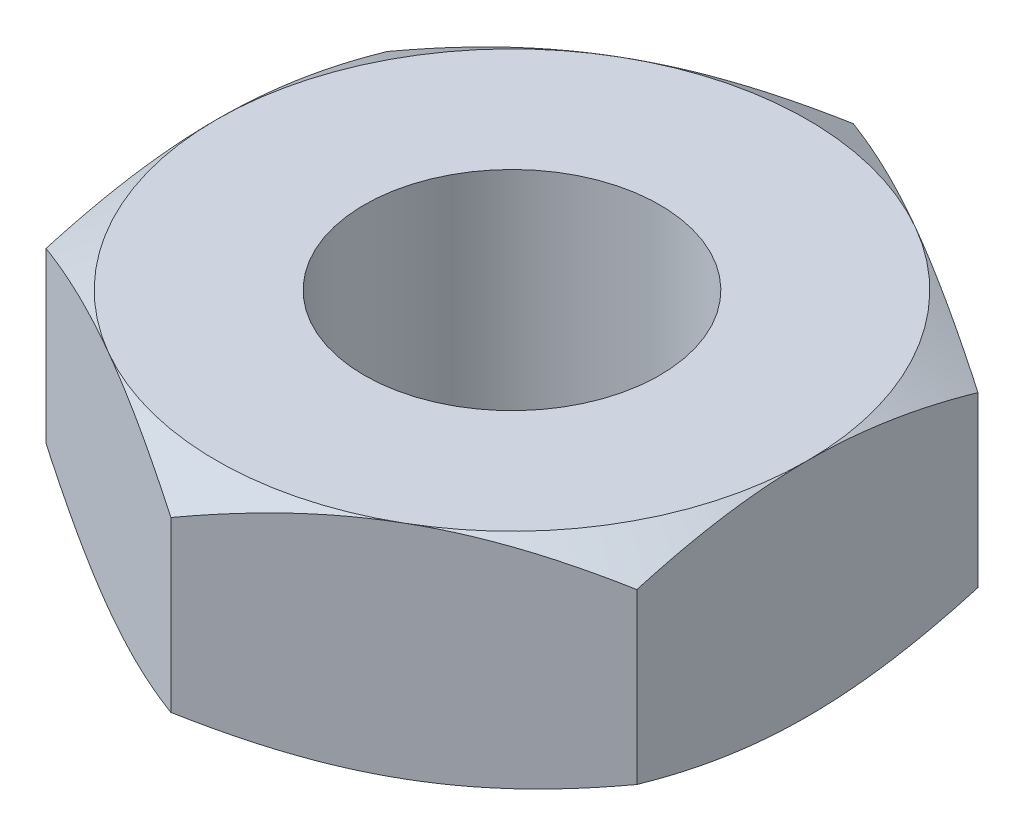
ISO-10303-21;
HEADER;
FILE_DESCRIPTION(('STEP AP214'),'2;1');
FILE_NAME('part.step','',(''),(''),'','','');
FILE_SCHEMA(('AUTOMOTIVE_DESIGN { 1 0 10303 214 1 1 1 1 }'));
ENDSEC;
DATA;
#1=APPLICATION_CONTEXT('core data for automotive mechanical design processes');
#2=APPLICATION_PROTOCOL_DEFINITION('international standard','automotive_design',2000,#1);
#3=PRODUCT_CONTEXT('',#1,'mechanical');
#4=PRODUCT('Part','Part','',(#3));
#5=PRODUCT_RELATED_PRODUCT_CATEGORY('part','',(#4));
#6=PRODUCT_DEFINITION_FORMATION('','',#4);
#7=PRODUCT_DEFINITION_CONTEXT('part definition',#1,'design');
#8=PRODUCT_DEFINITION('design','',#6,#7);
#9=PRODUCT_DEFINITION_SHAPE('','',#8);
#10=(LENGTH_UNIT() NAMED_UNIT(*) SI_UNIT(.MILLI.,.METRE.));
#11=(NAMED_UNIT(*) PLANE_ANGLE_UNIT() SI_UNIT($,.RADIAN.));
#12=(NAMED_UNIT(*) SI_UNIT($,.STERADIAN.) SOLID_ANGLE_UNIT());
#13=UNCERTAINTY_MEASURE_WITH_UNIT(LENGTH_MEASURE(1.E-05),#10,'distance_accuracy_value','');
#14=(GEOMETRIC_REPRESENTATION_CONTEXT(3) GLOBAL_UNCERTAINTY_ASSIGNED_CONTEXT((#13)) GLOBAL_UNIT_ASSIGNED_CONTEXT((#10,
#11,#12)) REPRESENTATION_CONTEXT('',''));
#15=CARTESIAN_POINT('',(0.,0.,0.));
#16=DIRECTION('',(0.,0.,1.));
#17=DIRECTION('',(1.,0.,0.));
#18=AXIS2_PLACEMENT_3D('',#15,#16,#17);
#19=CARTESIAN_POINT('',(0.,0.,0.));
#20=DIRECTION('',(0.,1.,0.));
#21=DIRECTION('',(0.,0.,1.));
#22=AXIS2_PLACEMENT_3D('',#19,#20,#21);
#23=PLANE('',#22);
#24=CARTESIAN_POINT('',(0.,0.,0.));
#25=DIRECTION('',(0.,1.,0.));
#26=DIRECTION('',(0.,0.,1.));
#27=AXIS2_PLACEMENT_3D('',#24,#25,#26);
#28=CIRCLE('',#27,1.);
#29=CARTESIAN_POINT('',(0.,0.,1.));
#30=VERTEX_POINT('',#29);
#31=EDGE_CURVE('E277',#30,#30,#28,.T.);
#32=ORIENTED_EDGE('',*,*,#31,.T.);
#33=EDGE_LOOP('',(#32));
#34=FACE_BOUND('',#33,.T.);
#35=CARTESIAN_POINT('',(0.,0.,0.));
#36=DIRECTION('',(0.,1.,0.));
#37=DIRECTION('',(0.,0.,1.));
#38=AXIS2_PLACEMENT_3D('',#35,#36,#37);
#39=CIRCLE('',#38,2.);
#40=CARTESIAN_POINT('',(1.,0.,1.73205080756888));
#41=VERTEX_POINT('',#40);
#42=CARTESIAN_POINT('',(-1.,0.,1.73205080756888));
#43=VERTEX_POINT('',#42);
#44=EDGE_CURVE('E52',#41,#43,#39,.F.);
#45=ORIENTED_EDGE('',*,*,#44,.T.);
#46=CARTESIAN_POINT('',(-2.,0.,0.));
#47=VERTEX_POINT('',#46);
#48=EDGE_CURVE('E12',#43,#47,#39,.F.);
#49=ORIENTED_EDGE('',*,*,#48,.T.);
#50=CARTESIAN_POINT('',(-1.,0.,-1.73205080756888));
#51=VERTEX_POINT('',#50);
#52=EDGE_CURVE('E58',#47,#51,#39,.F.);
#53=ORIENTED_EDGE('',*,*,#52,.T.);
#54=CARTESIAN_POINT('',(1.,0.,-1.73205080756888));
#55=VERTEX_POINT('',#54);
#56=EDGE_CURVE('E398',#51,#55,#39,.F.);
#57=ORIENTED_EDGE('',*,*,#56,.T.);
#58=CARTESIAN_POINT('',(2.,0.,0.));
#59=VERTEX_POINT('',#58);
#60=EDGE_CURVE('E161',#55,#59,#39,.F.);
#61=ORIENTED_EDGE('',*,*,#60,.T.);
#62=CARTESIAN_POINT('',(0.,0.,0.));
#63=DIRECTION('',(0.,1.,0.));
#64=DIRECTION('',(0.,0.,1.));
#65=AXIS2_PLACEMENT_3D('',#62,#63,#64);
#66=CIRCLE('',#65,2.);
#67=EDGE_CURVE('E142',#41,#59,#66,.T.);
#68=ORIENTED_EDGE('',*,*,#67,.F.);
#69=EDGE_LOOP('',(#45,#49,#53,#57,#61,#68));
#70=FACE_BOUND('',#69,.T.);
#71=ADVANCED_FACE('F47',(#34,#70),#23,.F.);
#72=CARTESIAN_POINT('',(0.,1.5,0.));
#73=DIRECTION('',(0.,1.,0.));
#74=DIRECTION('',(0.,0.,1.));
#75=AXIS2_PLACEMENT_3D('',#72,#73,#74);
#76=PLANE('',#75);
#77=CARTESIAN_POINT('',(0.,1.5,0.));
#78=DIRECTION('',(0.,1.,0.));
#79=DIRECTION('',(0.,0.,1.));
#80=AXIS2_PLACEMENT_3D('',#77,#78,#79);
#81=CIRCLE('',#80,1.);
#82=CARTESIAN_POINT('',(0.,1.5,1.));
#83=VERTEX_POINT('',#82);
#84=EDGE_CURVE('E272',#83,#83,#81,.T.);
#85=ORIENTED_EDGE('',*,*,#84,.F.);
#86=EDGE_LOOP('',(#85));
#87=FACE_BOUND('',#86,.T.);
#88=CARTESIAN_POINT('',(0.,1.5,0.));
#89=DIRECTION('',(0.,1.,0.));
#90=DIRECTION('',(0.,0.,1.));
#91=AXIS2_PLACEMENT_3D('',#88,#89,#90);
#92=CIRCLE('',#91,2.);
#93=CARTESIAN_POINT('',(-1.,1.5,1.73205080756888));
#94=VERTEX_POINT('',#93);
#95=CARTESIAN_POINT('',(1.,1.5,1.73205080756888));
#96=VERTEX_POINT('',#95);
#97=EDGE_CURVE('E334',#94,#96,#92,.T.);
#98=ORIENTED_EDGE('',*,*,#97,.T.);
#99=CARTESIAN_POINT('',(2.,1.5,0.));
#100=VERTEX_POINT('',#99);
#101=EDGE_CURVE('E337',#96,#100,#92,.T.);
#102=ORIENTED_EDGE('',*,*,#101,.T.);
#103=CARTESIAN_POINT('',(1.,1.5,-1.73205080756888));
#104=VERTEX_POINT('',#103);
#105=EDGE_CURVE('E349',#100,#104,#92,.T.);
#106=ORIENTED_EDGE('',*,*,#105,.T.);
#107=CARTESIAN_POINT('',(-1.,1.5,-1.73205080756888));
#108=VERTEX_POINT('',#107);
#109=EDGE_CURVE('E353',#104,#108,#92,.T.);
#110=ORIENTED_EDGE('',*,*,#109,.T.);
#111=CARTESIAN_POINT('',(-2.,1.5,0.));
#112=VERTEX_POINT('',#111);
#113=EDGE_CURVE('E346',#108,#112,#92,.T.);
#114=ORIENTED_EDGE('',*,*,#113,.T.);
#115=EDGE_CURVE('E339',#112,#94,#92,.T.);
#116=ORIENTED_EDGE('',*,*,#115,.T.);
#117=EDGE_LOOP('',(#98,#102,#106,#110,#114,#116));
#118=FACE_BOUND('',#117,.T.);
#119=ADVANCED_FACE('F315',(#87,#118),#76,.T.);
#120=CARTESIAN_POINT('',(2.,1.5,-1.15470053837925));
#121=DIRECTION('',(-0.5,0.,0.866025403784439));
#122=DIRECTION('',(0.866025403784439,0.,0.5));
#123=AXIS2_PLACEMENT_3D('',#120,#121,#122);
#124=PLANE('',#123);
#125=DIRECTION('',(0.,-1.,0.));
#126=VECTOR('',#125,1.);
#127=CARTESIAN_POINT('',(2.,1.5,-1.15470053837925));
#128=LINE('',#127,#126);
#129=CARTESIAN_POINT('',(2.,1.32136720504593,-1.15470053837926));
#130=VERTEX_POINT('',#129);
#131=CARTESIAN_POINT('',(2.,0.17863279495408,-1.15470053837925));
#132=VERTEX_POINT('',#131);
#133=EDGE_CURVE('E276',#130,#132,#128,.T.);
#134=ORIENTED_EDGE('',*,*,#133,.T.);
#135=CARTESIAN_POINT('',(2.0002,0.178699466620497,-1.15458506832542));
#136=CARTESIAN_POINT('',(1.91230873709994,0.149389536100678,-1.20532911262018));
#137=CARTESIAN_POINT('',(1.82365880552641,0.122732851980467,-1.2565111744778));
#138=CARTESIAN_POINT('',(1.6448237530022,0.0762024910207211,-1.3597616401932));
#139=CARTESIAN_POINT('',(1.55463545349496,0.0563452763827793,-1.41183187919145));
#140=CARTESIAN_POINT('',(1.37537661423669,0.0254334640232528,-1.51532701829183));
#141=CARTESIAN_POINT('',(1.28633366177369,0.0141731515985314,-1.56673599086578));
#142=CARTESIAN_POINT('',(1.10782860221496,0.000728662594642262,-1.66979593505373));
#143=CARTESIAN_POINT('',(1.01836714429604,-0.00146664504653133,-1.72144653186531));
#144=CARTESIAN_POINT('',(0.851191646451201,0.00309098933064936,-1.81796535054794));
#145=CARTESIAN_POINT('',(0.773452629734215,0.00872487468701514,-1.86284799277603));
#146=CARTESIAN_POINT('',(0.618481085463866,0.0265838952608289,-1.95232085557725));
#147=CARTESIAN_POINT('',(0.541249094258801,0.0388151360234399,-1.99691076648954));
#148=CARTESIAN_POINT('',(0.385957813517799,0.0693934368676102,-2.08656822922816));
#149=CARTESIAN_POINT('',(0.30791818689262,0.0878701670657161,-2.13162442866767));
#150=CARTESIAN_POINT('',(0.153003134307865,0.129805518212856,-2.221064675979));
#151=CARTESIAN_POINT('',(0.07612572237688,0.153254280492313,-2.26544987045196));
#152=CARTESIAN_POINT('',(-0.000199999999999827,0.178699466620498,-2.30951654681234));
#153=B_SPLINE_CURVE_WITH_KNOTS('',3,(#135,#136,#137,#138,#139,#140,#141,#142,#143,#144,#145,
#146,#147,#148,#149,#150,#151,#152),.UNSPECIFIED.,.F.,.F.,(4,2,2,2,2,2,2,2,4),(0.,
0.31703182469561,0.634825876346563,0.944753967652635,1.25430138000371,1.52387047293094,
1.79368946861028,2.06949491027634,2.34475850821472),.UNSPECIFIED.);
#154=EDGE_CURVE('E71',#132,#55,#153,.T.);
#155=ORIENTED_EDGE('',*,*,#154,.T.);
#156=CARTESIAN_POINT('',(0.,0.178632794954081,-2.3094010767585));
#157=VERTEX_POINT('',#156);
#158=EDGE_CURVE('E206',#55,#157,#153,.T.);
#159=ORIENTED_EDGE('',*,*,#158,.T.);
#160=DIRECTION('',(0.,-1.,0.));
#161=VECTOR('',#160,1.);
#162=CARTESIAN_POINT('',(0.,1.5,-2.3094010767585));
#163=LINE('',#162,#161);
#164=CARTESIAN_POINT('',(0.,1.32136720504592,-2.3094010767585));
#165=VERTEX_POINT('',#164);
#166=EDGE_CURVE('E297',#165,#157,#163,.T.);
#167=ORIENTED_EDGE('',*,*,#166,.F.);
#168=CARTESIAN_POINT('',(2.0002,1.3213005333795,-1.15458506832542));
#169=CARTESIAN_POINT('',(1.91230873709994,1.35061046389932,-1.20532911262018));
#170=CARTESIAN_POINT('',(1.82365880552641,1.37726714801953,-1.2565111744778));
#171=CARTESIAN_POINT('',(1.6448237530022,1.42379750897928,-1.3597616401932));
#172=CARTESIAN_POINT('',(1.55463545349496,1.44365472361722,-1.41183187919145));
#173=CARTESIAN_POINT('',(1.37537661423669,1.47456653597675,-1.51532701829183));
#174=CARTESIAN_POINT('',(1.28633366177369,1.48582684840147,-1.56673599086578));
#175=CARTESIAN_POINT('',(1.10782860221496,1.49927133740536,-1.66979593505373));
#176=CARTESIAN_POINT('',(1.01836714429604,1.50146664504653,-1.72144653186531));
#177=CARTESIAN_POINT('',(0.851191646451201,1.49690901066935,-1.81796535054794));
#178=CARTESIAN_POINT('',(0.773452629734215,1.49127512531298,-1.86284799277603));
#179=CARTESIAN_POINT('',(0.618481085463866,1.47341610473917,-1.95232085557725));
#180=CARTESIAN_POINT('',(0.541249094258801,1.46118486397656,-1.99691076648954));
#181=CARTESIAN_POINT('',(0.385957813517799,1.43060656313239,-2.08656822922816));
#182=CARTESIAN_POINT('',(0.30791818689262,1.41212983293428,-2.13162442866767));
#183=CARTESIAN_POINT('',(0.153003134307865,1.37019448178714,-2.221064675979));
#184=CARTESIAN_POINT('',(0.07612572237688,1.34674571950769,-2.26544987045196));
#185=CARTESIAN_POINT('',(-0.000199999999999837,1.3213005333795,-2.30951654681234));
#186=B_SPLINE_CURVE_WITH_KNOTS('',3,(#168,#169,#170,#171,#172,#173,#174,#175,#176,#177,#178,
#179,#180,#181,#182,#183,#184,#185),.UNSPECIFIED.,.F.,.F.,(4,2,2,2,2,2,2,2,4),(0.,
0.31703182469561,0.634825876346563,0.944753967652635,1.25430138000371,1.52387047293094,
1.79368946861028,2.06949491027634,2.34475850821472),.UNSPECIFIED.);
#187=EDGE_CURVE('E264',#104,#165,#186,.T.);
#188=ORIENTED_EDGE('',*,*,#187,.F.);
#189=EDGE_CURVE('E271',#130,#104,#186,.T.);
#190=ORIENTED_EDGE('',*,*,#189,.F.);
#191=EDGE_LOOP('',(#134,#155,#159,#167,#188,#190));
#192=FACE_BOUND('',#191,.T.);
#193=ADVANCED_FACE('F49',(#192),#124,.F.);
#194=CARTESIAN_POINT('',(0.,1.5,-2.3094010767585));
#195=DIRECTION('',(0.5,0.,0.866025403784439));
#196=DIRECTION('',(0.866025403784439,0.,-0.5));
#197=AXIS2_PLACEMENT_3D('',#194,#195,#196);
#198=PLANE('',#197);
#199=ORIENTED_EDGE('',*,*,#166,.T.);
#200=CARTESIAN_POINT('',(0.000200000000000053,0.178699466620498,-2.30951654681234));
#201=CARTESIAN_POINT('',(-0.0876912629000601,0.149389536100679,-2.25877250251758));
#202=CARTESIAN_POINT('',(-0.176341194473591,0.122732851980467,-2.20759044065996));
#203=CARTESIAN_POINT('',(-0.355176246997802,0.0762024910207212,-2.10433997494456));
#204=CARTESIAN_POINT('',(-0.445364546505037,0.0563452763827794,-2.05226973594631));
#205=CARTESIAN_POINT('',(-0.624623385763306,0.025433464023253,-1.94877459684592));
#206=CARTESIAN_POINT('',(-0.713666338226304,0.0141731515985316,-1.89736562427197));
#207=CARTESIAN_POINT('',(-0.892171397785043,0.000728662594642333,-1.79430568008402));
#208=CARTESIAN_POINT('',(-0.981632855703958,-0.00146664504653142,-1.74265508327244));
#209=CARTESIAN_POINT('',(-1.1488083535488,0.00309098933064909,-1.64613626458981));
#210=CARTESIAN_POINT('',(-1.22654737026578,0.00872487468701486,-1.60125362236173));
#211=CARTESIAN_POINT('',(-1.38151891453613,0.0265838952608287,-1.51178075956051));
#212=CARTESIAN_POINT('',(-1.4587509057412,0.0388151360234397,-1.46719084864821));
#213=CARTESIAN_POINT('',(-1.6140421864822,0.0693934368676102,-1.37753338590959));
#214=CARTESIAN_POINT('',(-1.69208181310738,0.0878701670657163,-1.33247718647009));
#215=CARTESIAN_POINT('',(-1.84699686569214,0.129805518212856,-1.24303693915875));
#216=CARTESIAN_POINT('',(-1.92387427762312,0.153254280492314,-1.1986517446858));
#217=CARTESIAN_POINT('',(-2.0002,0.178699466620498,-1.15458506832541));
#218=B_SPLINE_CURVE_WITH_KNOTS('',3,(#200,#201,#202,#203,#204,#205,#206,#207,#208,#209,#210,
#211,#212,#213,#214,#215,#216,#217),.UNSPECIFIED.,.F.,.F.,(4,2,2,2,2,2,2,2,4),(0.,
0.31703182469561,0.634825876346564,0.944753967652636,1.25430138000371,1.52387047293094,
1.79368946861028,2.06949491027634,2.34475850821472),.UNSPECIFIED.);
#219=EDGE_CURVE('E404',#157,#51,#218,.T.);
#220=ORIENTED_EDGE('',*,*,#219,.T.);
#221=CARTESIAN_POINT('',(-2.,0.178632794954081,-1.15470053837925));
#222=VERTEX_POINT('',#221);
#223=EDGE_CURVE('E225',#51,#222,#218,.T.);
#224=ORIENTED_EDGE('',*,*,#223,.T.);
#225=DIRECTION('',(0.,-1.,0.));
#226=VECTOR('',#225,1.);
#227=CARTESIAN_POINT('',(-2.,1.5,-1.15470053837925));
#228=LINE('',#227,#226);
#229=CARTESIAN_POINT('',(-2.,1.32136720504592,-1.15470053837925));
#230=VERTEX_POINT('',#229);
#231=EDGE_CURVE('E293',#230,#222,#228,.T.);
#232=ORIENTED_EDGE('',*,*,#231,.F.);
#233=CARTESIAN_POINT('',(0.000200000000000067,1.3213005333795,-2.30951654681234));
#234=CARTESIAN_POINT('',(-0.0876912629000599,1.35061046389932,-2.25877250251758));
#235=CARTESIAN_POINT('',(-0.176341194473591,1.37726714801953,-2.20759044065996));
#236=CARTESIAN_POINT('',(-0.355176246997802,1.42379750897928,-2.10433997494456));
#237=CARTESIAN_POINT('',(-0.445364546505037,1.44365472361722,-2.05226973594631));
#238=CARTESIAN_POINT('',(-0.624623385763306,1.47456653597675,-1.94877459684592));
#239=CARTESIAN_POINT('',(-0.713666338226304,1.48582684840147,-1.89736562427197));
#240=CARTESIAN_POINT('',(-0.892171397785043,1.49927133740536,-1.79430568008402));
#241=CARTESIAN_POINT('',(-0.981632855703958,1.50146664504653,-1.74265508327244));
#242=CARTESIAN_POINT('',(-1.1488083535488,1.49690901066935,-1.64613626458981));
#243=CARTESIAN_POINT('',(-1.22654737026578,1.49127512531299,-1.60125362236173));
#244=CARTESIAN_POINT('',(-1.38151891453613,1.47341610473917,-1.51178075956051));
#245=CARTESIAN_POINT('',(-1.4587509057412,1.46118486397656,-1.46719084864821));
#246=CARTESIAN_POINT('',(-1.6140421864822,1.43060656313239,-1.37753338590959));
#247=CARTESIAN_POINT('',(-1.69208181310738,1.41212983293428,-1.33247718647009));
#248=CARTESIAN_POINT('',(-1.84699686569214,1.37019448178714,-1.24303693915875));
#249=CARTESIAN_POINT('',(-1.92387427762312,1.34674571950769,-1.1986517446858));
#250=CARTESIAN_POINT('',(-2.0002,1.3213005333795,-1.15458506832541));
#251=B_SPLINE_CURVE_WITH_KNOTS('',3,(#233,#234,#235,#236,#237,#238,#239,#240,#241,#242,#243,
#244,#245,#246,#247,#248,#249,#250),.UNSPECIFIED.,.F.,.F.,(4,2,2,2,2,2,2,2,4),(0.,
0.31703182469561,0.634825876346564,0.944753967652636,1.25430138000371,1.52387047293094,
1.79368946861028,2.06949491027634,2.34475850821472),.UNSPECIFIED.);
#252=EDGE_CURVE('E256',#108,#230,#251,.T.);
#253=ORIENTED_EDGE('',*,*,#252,.F.);
#254=EDGE_CURVE('E263',#165,#108,#251,.T.);
#255=ORIENTED_EDGE('',*,*,#254,.F.);
#256=EDGE_LOOP('',(#199,#220,#224,#232,#253,#255));
#257=FACE_BOUND('',#256,.T.);
#258=ADVANCED_FACE('F234',(#257),#198,.F.);
#259=CARTESIAN_POINT('',(-2.,1.5,-1.15470053837925));
#260=DIRECTION('',(1.,0.,0.));
#261=DIRECTION('',(0.,0.,-1.));
#262=AXIS2_PLACEMENT_3D('',#259,#260,#261);
#263=PLANE('',#262);
#264=ORIENTED_EDGE('',*,*,#231,.T.);
#265=CARTESIAN_POINT('',(-2.,1.38024356206322,-3.9086858120223));
#266=CARTESIAN_POINT('',(-2.,1.33338477520942,-3.81751112169324));
#267=CARTESIAN_POINT('',(-2.,1.28679021631781,-3.72620145046507));
#268=CARTESIAN_POINT('',(-2.,1.19424910626193,-3.54325228824929));
#269=CARTESIAN_POINT('',(-2.,1.14830256761152,-3.45161279093522));
#270=CARTESIAN_POINT('',(-2.,1.01146715761723,-3.17581300243889));
#271=CARTESIAN_POINT('',(-2.,0.921737415753044,-2.9910709203634));
#272=CARTESIAN_POINT('',(-2.,0.788409395654004,-2.70743624323685));
#273=CARTESIAN_POINT('',(-2.,0.743100656319978,-2.60934831774003));
#274=CARTESIAN_POINT('',(-2.,0.654163775473777,-2.41241507533712));
#275=CARTESIAN_POINT('',(-2.,0.610535569794257,-2.31356978752232));
#276=CARTESIAN_POINT('',(-2.,0.52546531263082,-2.11501734395706));
#277=CARTESIAN_POINT('',(-2.,0.484021797433511,-2.0153108187193));
#278=CARTESIAN_POINT('',(-2.,0.403937006613858,-1.81474539793162));
#279=CARTESIAN_POINT('',(-2.,0.365296392668009,-1.71388623674348));
#280=CARTESIAN_POINT('',(-2.,0.285617620657406,-1.49400593807688));
#281=CARTESIAN_POINT('',(-2.,0.245241020544741,-1.37474151517002));
#282=CARTESIAN_POINT('',(-2.,0.171425178991217,-1.13410850020832));
#283=CARTESIAN_POINT('',(-2.,0.137982386760639,-1.0127410198025));
#284=CARTESIAN_POINT('',(-2.,0.0810163135177482,-0.770071934944816));
#285=CARTESIAN_POINT('',(-2.,0.05731644498316,-0.648812992268315));
#286=CARTESIAN_POINT('',(-2.,0.0214266196550797,-0.404608758962328));
#287=CARTESIAN_POINT('',(-2.,0.00922997508793498,-0.28166449038841));
#288=CARTESIAN_POINT('',(-2.,-0.00207085477321424,-0.0335419748269807));
#289=CARTESIAN_POINT('',(-2.,-0.00100267071105174,0.0916445286709651));
#290=CARTESIAN_POINT('',(-2.,0.0144840452379088,0.341193409529001));
#291=CARTESIAN_POINT('',(-2.,0.028907354371388,0.465555475947228));
#292=CARTESIAN_POINT('',(-2.,0.0695474304125028,0.714833183390078));
#293=CARTESIAN_POINT('',(-2.,0.0959955839540993,0.839709642184882));
#294=CARTESIAN_POINT('',(-2.,0.157986894429598,1.08715459095749));
#295=CARTESIAN_POINT('',(-2.,0.193532661864587,1.20972240762972));
#296=CARTESIAN_POINT('',(-2.,0.269280519283634,1.44650470413582));
#297=CARTESIAN_POINT('',(-2.,0.309153182000627,1.56082665519536));
#298=CARTESIAN_POINT('',(-2.,0.393292544621002,1.78785420479763));
#299=CARTESIAN_POINT('',(-2.,0.437560254612616,1.90055942493322));
#300=CARTESIAN_POINT('',(-2.,0.529372373860236,2.12474648121528));
#301=CARTESIAN_POINT('',(-2.,0.576919977737399,2.23622699843601));
#302=CARTESIAN_POINT('',(-2.,0.674434984945331,2.45812606854002));
#303=CARTESIAN_POINT('',(-2.,0.724402516378928,2.56854456483182));
#304=CARTESIAN_POINT('',(-2.,0.823331957292793,2.78238975570627));
#305=CARTESIAN_POINT('',(-2.,0.87219431445944,2.88586269009035));
#306=CARTESIAN_POINT('',(-2.,0.971202074310625,3.09219555395058));
#307=CARTESIAN_POINT('',(-2.,1.02134751719606,3.19505546409504));
#308=CARTESIAN_POINT('',(-2.,1.12249261908677,3.39994809054478));
#309=CARTESIAN_POINT('',(-2.,1.1734890679984,3.50198239517474));
#310=CARTESIAN_POINT('',(-2.,1.27629914354311,3.70562803087648));
#311=CARTESIAN_POINT('',(-2.,1.32811270118693,3.80723939675145));
#312=CARTESIAN_POINT('',(-2.,1.38024356206322,3.9086858120223));
#313=B_SPLINE_CURVE_WITH_KNOTS('',3,(#265,#266,#267,#268,#269,#270,#271,#272,#273,#274,#275,
#276,#277,#278,#279,#280,#281,#282,#283,#284,#285,#286,#287,#288,#289,#290,#291,#292,#293,#294,
#295,#296,#297,#298,#299,#300,#301,#302,#303,#304,#305,#306,#307,#308,#309,#310,#311,#312),
.UNSPECIFIED.,.F.,.F.,(4,2,2,2,2,2,2,2,2,2,2,2,2,2,2,2,2,2,2,2,2,2,2,4),(0.,0.307531563856155,
0.615069058317577,1.23115557383005,1.55528461857819,1.8794012749051,2.20329794302309,
2.52727082574405,2.9048604545366,3.28225624019068,3.65247322929853,4.02247484779028,
4.39728941630346,4.77223811112902,5.15472880172826,5.53732936883045,5.90044039858863,
6.26363507408059,6.62718863760779,6.99076146751935,7.33404016464889,7.67732963038956,
8.01953135999517,8.36170435024385),.UNSPECIFIED.);
#314=EDGE_CURVE('E224',#222,#47,#313,.T.);
#315=ORIENTED_EDGE('',*,*,#314,.T.);
#316=CARTESIAN_POINT('',(-2.,0.178632794954081,1.15470053837925));
#317=VERTEX_POINT('',#316);
#318=EDGE_CURVE('E216',#47,#317,#313,.T.);
#319=ORIENTED_EDGE('',*,*,#318,.T.);
#320=DIRECTION('',(0.,-1.,0.));
#321=VECTOR('',#320,1.);
#322=CARTESIAN_POINT('',(-2.,1.5,1.15470053837925));
#323=LINE('',#322,#321);
#324=CARTESIAN_POINT('',(-2.,1.32136720504592,1.15470053837925));
#325=VERTEX_POINT('',#324);
#326=EDGE_CURVE('E289',#325,#317,#323,.T.);
#327=ORIENTED_EDGE('',*,*,#326,.F.);
#328=CARTESIAN_POINT('',(-2.,0.119756437936776,-3.9086858120223));
#329=CARTESIAN_POINT('',(-2.,0.166615224790584,-3.81751112169324));
#330=CARTESIAN_POINT('',(-2.,0.213209783682193,-3.72620145046507));
#331=CARTESIAN_POINT('',(-2.,0.305750893738074,-3.54325228824929));
#332=CARTESIAN_POINT('',(-2.,0.351697432388484,-3.45161279093522));
#333=CARTESIAN_POINT('',(-2.,0.488532842382774,-3.17581300243889));
#334=CARTESIAN_POINT('',(-2.,0.578262584246957,-2.9910709203634));
#335=CARTESIAN_POINT('',(-2.,0.711590604345996,-2.70743624323685));
#336=CARTESIAN_POINT('',(-2.,0.756899343680022,-2.60934831774002));
#337=CARTESIAN_POINT('',(-2.,0.845836224526223,-2.41241507533712));
#338=CARTESIAN_POINT('',(-2.,0.889464430205744,-2.31356978752232));
#339=CARTESIAN_POINT('',(-2.,0.974534687369181,-2.11501734395706));
#340=CARTESIAN_POINT('',(-2.,1.01597820256649,-2.0153108187193));
#341=CARTESIAN_POINT('',(-2.,1.09606299338614,-1.81474539793162));
#342=CARTESIAN_POINT('',(-2.,1.13470360733199,-1.71388623674348));
#343=CARTESIAN_POINT('',(-2.,1.21438237934259,-1.49400593807688));
#344=CARTESIAN_POINT('',(-2.,1.25475897945526,-1.37474151517002));
#345=CARTESIAN_POINT('',(-2.,1.32857482100878,-1.13410850020832));
#346=CARTESIAN_POINT('',(-2.,1.36201761323936,-1.0127410198025));
#347=CARTESIAN_POINT('',(-2.,1.41898368648225,-0.770071934944816));
#348=CARTESIAN_POINT('',(-2.,1.44268355501684,-0.648812992268316));
#349=CARTESIAN_POINT('',(-2.,1.47857338034492,-0.404608758962328));
#350=CARTESIAN_POINT('',(-2.,1.49077002491207,-0.281664490388411));
#351=CARTESIAN_POINT('',(-2.,1.50207085477321,-0.0335419748269812));
#352=CARTESIAN_POINT('',(-2.,1.50100267071105,0.0916445286709645));
#353=CARTESIAN_POINT('',(-2.,1.48551595476209,0.341193409529));
#354=CARTESIAN_POINT('',(-2.,1.47109264562861,0.465555475947226));
#355=CARTESIAN_POINT('',(-2.,1.4304525695875,0.714833183390077));
#356=CARTESIAN_POINT('',(-2.,1.4040044160459,0.83970964218488));
#357=CARTESIAN_POINT('',(-2.,1.3420131055704,1.08715459095749));
#358=CARTESIAN_POINT('',(-2.,1.30646733813541,1.20972240762972));
#359=CARTESIAN_POINT('',(-2.,1.23071948071637,1.44650470413582));
#360=CARTESIAN_POINT('',(-2.,1.19084681799937,1.56082665519536));
#361=CARTESIAN_POINT('',(-2.,1.106707455379,1.78785420479763));
#362=CARTESIAN_POINT('',(-2.,1.06243974538738,1.90055942493322));
#363=CARTESIAN_POINT('',(-2.,0.970627626139764,2.12474648121528));
#364=CARTESIAN_POINT('',(-2.,0.923080022262602,2.23622699843601));
#365=CARTESIAN_POINT('',(-2.,0.82556501505467,2.45812606854002));
#366=CARTESIAN_POINT('',(-2.,0.775597483621073,2.56854456483182));
#367=CARTESIAN_POINT('',(-2.,0.676668042707208,2.78238975570627));
#368=CARTESIAN_POINT('',(-2.,0.627805685540561,2.88586269009034));
#369=CARTESIAN_POINT('',(-2.,0.528797925689376,3.09219555395058));
#370=CARTESIAN_POINT('',(-2.,0.478652482803938,3.19505546409504));
#371=CARTESIAN_POINT('',(-2.,0.377507380913227,3.39994809054478));
#372=CARTESIAN_POINT('',(-2.,0.326510932001601,3.50198239517474));
#373=CARTESIAN_POINT('',(-2.,0.223700856456885,3.70562803087648));
#374=CARTESIAN_POINT('',(-2.,0.17188729881307,3.80723939675145));
#375=CARTESIAN_POINT('',(-2.,0.119756437936776,3.9086858120223));
#376=B_SPLINE_CURVE_WITH_KNOTS('',3,(#328,#329,#330,#331,#332,#333,#334,#335,#336,#337,#338,
#339,#340,#341,#342,#343,#344,#345,#346,#347,#348,#349,#350,#351,#352,#353,#354,#355,#356,#357,
#358,#359,#360,#361,#362,#363,#364,#365,#366,#367,#368,#369,#370,#371,#372,#373,#374,#375),
.UNSPECIFIED.,.F.,.F.,(4,2,2,2,2,2,2,2,2,2,2,2,2,2,2,2,2,2,2,2,2,2,2,4),(0.,0.307531563856155,
0.615069058317578,1.23115557383005,1.55528461857819,1.8794012749051,2.20329794302309,
2.52727082574405,2.9048604545366,3.28225624019068,3.65247322929853,4.02247484779028,
4.39728941630346,4.77223811112902,5.15472880172826,5.53732936883045,5.90044039858863,
6.26363507408059,6.62718863760779,6.99076146751935,7.33404016464889,7.67732963038956,
8.01953135999518,8.36170435024385),.UNSPECIFIED.);
#377=EDGE_CURVE('E240',#112,#325,#376,.T.);
#378=ORIENTED_EDGE('',*,*,#377,.F.);
#379=EDGE_CURVE('E248',#230,#112,#376,.T.);
#380=ORIENTED_EDGE('',*,*,#379,.F.);
#381=EDGE_LOOP('',(#264,#315,#319,#327,#378,#380));
#382=FACE_BOUND('',#381,.T.);
#383=ADVANCED_FACE('F230',(#382),#263,.F.);
#384=CARTESIAN_POINT('',(-2.,1.5,1.15470053837925));
#385=DIRECTION('',(0.5,0.,-0.866025403784439));
#386=DIRECTION('',(-0.866025403784439,0.,-0.5));
#387=AXIS2_PLACEMENT_3D('',#384,#385,#386);
#388=PLANE('',#387);
#389=ORIENTED_EDGE('',*,*,#326,.T.);
#390=CARTESIAN_POINT('',(-2.0002,0.178699466620497,1.15458506832541));
#391=CARTESIAN_POINT('',(-1.91230873709994,0.149389536100679,1.20532911262018));
#392=CARTESIAN_POINT('',(-1.82365880552641,0.122732851980467,1.2565111744778));
#393=CARTESIAN_POINT('',(-1.6448237530022,0.076202491020721,1.35976164019319));
#394=CARTESIAN_POINT('',(-1.55463545349496,0.0563452763827792,1.41183187919145));
#395=CARTESIAN_POINT('',(-1.37537661423669,0.0254334640232525,1.51532701829183));
#396=CARTESIAN_POINT('',(-1.2863336617737,0.0141731515985311,1.56673599086578));
#397=CARTESIAN_POINT('',(-1.10782860221496,0.000728662594641898,1.66979593505373));
#398=CARTESIAN_POINT('',(-1.01836714429604,-0.00146664504653173,1.72144653186531));
#399=CARTESIAN_POINT('',(-0.851191646451202,0.00309098933064889,1.81796535054794));
#400=CARTESIAN_POINT('',(-0.773452629734217,0.00872487468701465,1.86284799277603));
#401=CARTESIAN_POINT('',(-0.618481085463867,0.0265838952608284,1.95232085557725));
#402=CARTESIAN_POINT('',(-0.541249094258802,0.0388151360234394,1.99691076648954));
#403=CARTESIAN_POINT('',(-0.3859578135178,0.0693934368676098,2.08656822922816));
#404=CARTESIAN_POINT('',(-0.307918186892621,0.0878701670657158,2.13162442866767));
#405=CARTESIAN_POINT('',(-0.153003134307866,0.129805518212856,2.221064675979));
#406=CARTESIAN_POINT('',(-0.0761257223768806,0.153254280492313,2.26544987045196));
#407=CARTESIAN_POINT('',(0.00019999999999956,0.178699466620497,2.30951654681234));
#408=B_SPLINE_CURVE_WITH_KNOTS('',3,(#390,#391,#392,#393,#394,#395,#396,#397,#398,#399,#400,
#401,#402,#403,#404,#405,#406,#407),.UNSPECIFIED.,.F.,.F.,(4,2,2,2,2,2,2,2,4),(0.,
0.31703182469561,0.634825876346563,0.944753967652635,1.25430138000371,1.52387047293094,
1.79368946861028,2.06949491027634,2.34475850821472),.UNSPECIFIED.);
#409=EDGE_CURVE('E174',#317,#43,#408,.T.);
#410=ORIENTED_EDGE('',*,*,#409,.T.);
#411=CARTESIAN_POINT('',(0.,0.178632794954081,2.3094010767585));
#412=VERTEX_POINT('',#411);
#413=EDGE_CURVE('E157',#43,#412,#408,.T.);
#414=ORIENTED_EDGE('',*,*,#413,.T.);
#415=DIRECTION('',(0.,-1.,0.));
#416=VECTOR('',#415,1.);
#417=CARTESIAN_POINT('',(0.,1.5,2.3094010767585));
#418=LINE('',#417,#416);
#419=CARTESIAN_POINT('',(0.,1.32136720504592,2.3094010767585));
#420=VERTEX_POINT('',#419);
#421=EDGE_CURVE('E171',#420,#412,#418,.T.);
#422=ORIENTED_EDGE('',*,*,#421,.F.);
#423=CARTESIAN_POINT('',(-2.0002,1.3213005333795,1.15458506832541));
#424=CARTESIAN_POINT('',(-1.91230873709994,1.35061046389932,1.20532911262018));
#425=CARTESIAN_POINT('',(-1.82365880552641,1.37726714801953,1.2565111744778));
#426=CARTESIAN_POINT('',(-1.6448237530022,1.42379750897928,1.35976164019319));
#427=CARTESIAN_POINT('',(-1.55463545349496,1.44365472361722,1.41183187919145));
#428=CARTESIAN_POINT('',(-1.37537661423669,1.47456653597675,1.51532701829183));
#429=CARTESIAN_POINT('',(-1.2863336617737,1.48582684840147,1.56673599086578));
#430=CARTESIAN_POINT('',(-1.10782860221496,1.49927133740536,1.66979593505373));
#431=CARTESIAN_POINT('',(-1.01836714429604,1.50146664504653,1.72144653186531));
#432=CARTESIAN_POINT('',(-0.851191646451202,1.49690901066935,1.81796535054794));
#433=CARTESIAN_POINT('',(-0.773452629734217,1.49127512531299,1.86284799277603));
#434=CARTESIAN_POINT('',(-0.618481085463867,1.47341610473917,1.95232085557725));
#435=CARTESIAN_POINT('',(-0.541249094258802,1.46118486397656,1.99691076648954));
#436=CARTESIAN_POINT('',(-0.3859578135178,1.43060656313239,2.08656822922816));
#437=CARTESIAN_POINT('',(-0.307918186892621,1.41212983293428,2.13162442866767));
#438=CARTESIAN_POINT('',(-0.153003134307866,1.37019448178714,2.221064675979));
#439=CARTESIAN_POINT('',(-0.0761257223768807,1.34674571950769,2.26544987045196));
#440=CARTESIAN_POINT('',(0.000199999999999558,1.3213005333795,2.30951654681234));
#441=B_SPLINE_CURVE_WITH_KNOTS('',3,(#423,#424,#425,#426,#427,#428,#429,#430,#431,#432,#433,
#434,#435,#436,#437,#438,#439,#440),.UNSPECIFIED.,.F.,.F.,(4,2,2,2,2,2,2,2,4),(0.,
0.31703182469561,0.634825876346563,0.944753967652635,1.25430138000371,1.52387047293094,
1.79368946861028,2.06949491027634,2.34475850821472),.UNSPECIFIED.);
#442=EDGE_CURVE('E250',#94,#420,#441,.T.);
#443=ORIENTED_EDGE('',*,*,#442,.F.);
#444=EDGE_CURVE('E249',#325,#94,#441,.T.);
#445=ORIENTED_EDGE('',*,*,#444,.F.);
#446=EDGE_LOOP('',(#389,#410,#414,#422,#443,#445));
#447=FACE_BOUND('',#446,.T.);
#448=ADVANCED_FACE('F233',(#447),#388,.F.);
#449=CARTESIAN_POINT('',(0.,1.5,2.3094010767585));
#450=DIRECTION('',(-0.5,0.,-0.866025403784439));
#451=DIRECTION('',(-0.866025403784439,0.,0.5));
#452=AXIS2_PLACEMENT_3D('',#449,#450,#451);
#453=PLANE('',#452);
#454=ORIENTED_EDGE('',*,*,#421,.T.);
#455=CARTESIAN_POINT('',(-0.00020000000000036,0.178699466620497,2.30951654681234));
#456=CARTESIAN_POINT('',(0.0876912629000595,0.149389536100678,2.25877250251758));
#457=CARTESIAN_POINT('',(0.176341194473591,0.122732851980466,2.20759044065995));
#458=CARTESIAN_POINT('',(0.355176246997801,0.076202491020721,2.10433997494456));
#459=CARTESIAN_POINT('',(0.445364546505036,0.0563452763827792,2.0522697359463));
#460=CARTESIAN_POINT('',(0.624623385763305,0.0254334640232526,1.94877459684592));
#461=CARTESIAN_POINT('',(0.713666338226303,0.0141731515985311,1.89736562427197));
#462=CARTESIAN_POINT('',(0.892171397785042,0.000728662594641876,1.79430568008402));
#463=CARTESIAN_POINT('',(0.981632855703957,-0.00146664504653175,1.74265508327244));
#464=CARTESIAN_POINT('',(1.1488083535488,0.00309098933064891,1.64613626458981));
#465=CARTESIAN_POINT('',(1.22654737026578,0.00872487468701469,1.60125362236173));
#466=CARTESIAN_POINT('',(1.38151891453613,0.0265838952608285,1.51178075956051));
#467=CARTESIAN_POINT('',(1.4587509057412,0.0388151360234394,1.46719084864821));
#468=CARTESIAN_POINT('',(1.6140421864822,0.0693934368676097,1.37753338590959));
#469=CARTESIAN_POINT('',(1.69208181310738,0.0878701670657156,1.33247718647009));
#470=CARTESIAN_POINT('',(1.84699686569213,0.129805518212855,1.24303693915876));
#471=CARTESIAN_POINT('',(1.92387427762312,0.153254280492313,1.1986517446858));
#472=CARTESIAN_POINT('',(2.0002,0.178699466620497,1.15458506832541));
#473=B_SPLINE_CURVE_WITH_KNOTS('',3,(#455,#456,#457,#458,#459,#460,#461,#462,#463,#464,#465,
#466,#467,#468,#469,#470,#471,#472),.UNSPECIFIED.,.F.,.F.,(4,2,2,2,2,2,2,2,4),(0.,
0.31703182469561,0.634825876346563,0.944753967652635,1.25430138000371,1.52387047293094,
1.79368946861028,2.06949491027634,2.34475850821472),.UNSPECIFIED.);
#474=EDGE_CURVE('E151',#412,#41,#473,.T.);
#475=ORIENTED_EDGE('',*,*,#474,.T.);
#476=CARTESIAN_POINT('',(2.,0.17863279495408,1.15470053837925));
#477=VERTEX_POINT('',#476);
#478=EDGE_CURVE('E138',#41,#477,#473,.T.);
#479=ORIENTED_EDGE('',*,*,#478,.T.);
#480=DIRECTION('',(0.,-1.,0.));
#481=VECTOR('',#480,1.);
#482=CARTESIAN_POINT('',(2.,1.5,1.15470053837925));
#483=LINE('',#482,#481);
#484=CARTESIAN_POINT('',(2.,1.32136720504592,1.15470053837925));
#485=VERTEX_POINT('',#484);
#486=EDGE_CURVE('E284',#485,#477,#483,.T.);
#487=ORIENTED_EDGE('',*,*,#486,.F.);
#488=CARTESIAN_POINT('',(-0.000200000000000338,1.3213005333795,2.30951654681234));
#489=CARTESIAN_POINT('',(0.0876912629000595,1.35061046389932,2.25877250251758));
#490=CARTESIAN_POINT('',(0.176341194473591,1.37726714801953,2.20759044065995));
#491=CARTESIAN_POINT('',(0.355176246997801,1.42379750897928,2.10433997494456));
#492=CARTESIAN_POINT('',(0.445364546505036,1.44365472361722,2.0522697359463));
#493=CARTESIAN_POINT('',(0.624623385763305,1.47456653597675,1.94877459684592));
#494=CARTESIAN_POINT('',(0.713666338226303,1.48582684840147,1.89736562427197));
#495=CARTESIAN_POINT('',(0.892171397785042,1.49927133740536,1.79430568008402));
#496=CARTESIAN_POINT('',(0.981632855703957,1.50146664504653,1.74265508327244));
#497=CARTESIAN_POINT('',(1.1488083535488,1.49690901066935,1.64613626458981));
#498=CARTESIAN_POINT('',(1.22654737026578,1.49127512531299,1.60125362236173));
#499=CARTESIAN_POINT('',(1.38151891453613,1.47341610473917,1.51178075956051));
#500=CARTESIAN_POINT('',(1.4587509057412,1.46118486397656,1.46719084864821));
#501=CARTESIAN_POINT('',(1.6140421864822,1.43060656313239,1.37753338590959));
#502=CARTESIAN_POINT('',(1.69208181310738,1.41212983293428,1.33247718647009));
#503=CARTESIAN_POINT('',(1.84699686569213,1.37019448178714,1.24303693915875));
#504=CARTESIAN_POINT('',(1.92387427762312,1.34674571950769,1.1986517446858));
#505=CARTESIAN_POINT('',(2.0002,1.3213005333795,1.15458506832541));
#506=B_SPLINE_CURVE_WITH_KNOTS('',3,(#488,#489,#490,#491,#492,#493,#494,#495,#496,#497,#498,
#499,#500,#501,#502,#503,#504,#505),.UNSPECIFIED.,.F.,.F.,(4,2,2,2,2,2,2,2,4),(0.,
0.317031824695609,0.634825876346563,0.944753967652635,1.25430138000371,1.52387047293094,
1.79368946861028,2.06949491027634,2.34475850821472),.UNSPECIFIED.);
#507=EDGE_CURVE('E348',#96,#485,#506,.T.);
#508=ORIENTED_EDGE('',*,*,#507,.F.);
#509=EDGE_CURVE('E352',#420,#96,#506,.T.);
#510=ORIENTED_EDGE('',*,*,#509,.F.);
#511=EDGE_LOOP('',(#454,#475,#479,#487,#508,#510));
#512=FACE_BOUND('',#511,.T.);
#513=ADVANCED_FACE('F168',(#512),#453,.F.);
#514=CARTESIAN_POINT('',(2.,1.5,1.15470053837925));
#515=DIRECTION('',(-1.,0.,0.));
#516=DIRECTION('',(0.,0.,1.));
#517=AXIS2_PLACEMENT_3D('',#514,#515,#516);
#518=PLANE('',#517);
#519=ORIENTED_EDGE('',*,*,#486,.T.);
#520=CARTESIAN_POINT('',(2.,1.38024356206323,3.90868581202231));
#521=CARTESIAN_POINT('',(2.,1.33338477520942,3.81751112169325));
#522=CARTESIAN_POINT('',(2.,1.28679021631781,3.72620145046507));
#523=CARTESIAN_POINT('',(2.,1.19424910626193,3.54325228824929));
#524=CARTESIAN_POINT('',(2.,1.14830256761152,3.45161279093522));
#525=CARTESIAN_POINT('',(2.,1.01146715761723,3.1758130024389));
#526=CARTESIAN_POINT('',(2.,0.921737415753045,2.9910709203634));
#527=CARTESIAN_POINT('',(2.,0.788409395654005,2.70743624323685));
#528=CARTESIAN_POINT('',(2.,0.743100656319978,2.60934831774003));
#529=CARTESIAN_POINT('',(2.,0.654163775473777,2.41241507533712));
#530=CARTESIAN_POINT('',(2.,0.610535569794257,2.31356978752232));
#531=CARTESIAN_POINT('',(2.,0.52546531263082,2.11501734395706));
#532=CARTESIAN_POINT('',(2.,0.484021797433511,2.0153108187193));
#533=CARTESIAN_POINT('',(2.,0.403937006613858,1.81474539793162));
#534=CARTESIAN_POINT('',(2.,0.365296392668009,1.71388623674348));
#535=CARTESIAN_POINT('',(2.,0.285617620657406,1.49400593807688));
#536=CARTESIAN_POINT('',(2.,0.245241020544741,1.37474151517002));
#537=CARTESIAN_POINT('',(2.,0.171425178991217,1.13410850020832));
#538=CARTESIAN_POINT('',(2.,0.137982386760639,1.0127410198025));
#539=CARTESIAN_POINT('',(2.,0.081016313517748,0.770071934944818));
#540=CARTESIAN_POINT('',(2.,0.0573164449831596,0.648812992268317));
#541=CARTESIAN_POINT('',(2.,0.021426619655079,0.40460875896233));
#542=CARTESIAN_POINT('',(2.,0.00922997508793431,0.281664490388412));
#543=CARTESIAN_POINT('',(2.,-0.00207085477321504,0.0335419748269831));
#544=CARTESIAN_POINT('',(2.,-0.00100267071105268,-0.0916445286709624));
#545=CARTESIAN_POINT('',(2.,0.0144840452379078,-0.341193409528998));
#546=CARTESIAN_POINT('',(2.,0.0289073543713871,-0.465555475947224));
#547=CARTESIAN_POINT('',(2.,0.0695474304125017,-0.714833183390075));
#548=CARTESIAN_POINT('',(2.,0.0959955839540981,-0.839709642184879));
#549=CARTESIAN_POINT('',(2.,0.157986894429596,-1.08715459095749));
#550=CARTESIAN_POINT('',(2.,0.193532661864586,-1.20972240762972));
#551=CARTESIAN_POINT('',(2.,0.269280519283633,-1.44650470413582));
#552=CARTESIAN_POINT('',(2.,0.309153182000626,-1.56082665519536));
#553=CARTESIAN_POINT('',(2.,0.393292544621001,-1.78785420479763));
#554=CARTESIAN_POINT('',(2.,0.437560254612615,-1.90055942493322));
#555=CARTESIAN_POINT('',(2.,0.529372373860236,-2.12474648121528));
#556=CARTESIAN_POINT('',(2.,0.576919977737398,-2.23622699843601));
#557=CARTESIAN_POINT('',(2.,0.67443498494533,-2.45812606854002));
#558=CARTESIAN_POINT('',(2.,0.724402516378927,-2.56854456483182));
#559=CARTESIAN_POINT('',(2.,0.823331957292793,-2.78238975570627));
#560=CARTESIAN_POINT('',(2.,0.87219431445944,-2.88586269009035));
#561=CARTESIAN_POINT('',(2.,0.971202074310626,-3.09219555395059));
#562=CARTESIAN_POINT('',(2.,1.02134751719606,-3.19505546409504));
#563=CARTESIAN_POINT('',(2.,1.12249261908677,-3.39994809054478));
#564=CARTESIAN_POINT('',(2.,1.1734890679984,-3.50198239517475));
#565=CARTESIAN_POINT('',(2.,1.27629914354312,-3.70562803087649));
#566=CARTESIAN_POINT('',(2.,1.32811270118693,-3.80723939675146));
#567=CARTESIAN_POINT('',(2.,1.38024356206323,-3.90868581202231));
#568=B_SPLINE_CURVE_WITH_KNOTS('',3,(#520,#521,#522,#523,#524,#525,#526,#527,#528,#529,#530,
#531,#532,#533,#534,#535,#536,#537,#538,#539,#540,#541,#542,#543,#544,#545,#546,#547,#548,#549,
#550,#551,#552,#553,#554,#555,#556,#557,#558,#559,#560,#561,#562,#563,#564,#565,#566,#567),
.UNSPECIFIED.,.F.,.F.,(4,2,2,2,2,2,2,2,2,2,2,2,2,2,2,2,2,2,2,2,2,2,2,4),(0.,0.307531563856155,
0.615069058317577,1.23115557383005,1.55528461857819,1.8794012749051,2.2032979430231,
2.52727082574406,2.9048604545366,3.28225624019068,3.65247322929854,4.02247484779028,
4.39728941630346,4.77223811112903,5.15472880172826,5.53732936883045,5.90044039858863,
6.26363507408059,6.6271886376078,6.99076146751935,7.33404016464889,7.67732963038956,
8.01953135999518,8.36170435024386),.UNSPECIFIED.);
#569=EDGE_CURVE('E145',#477,#59,#568,.T.);
#570=ORIENTED_EDGE('',*,*,#569,.T.);
#571=EDGE_CURVE('E165',#59,#132,#568,.T.);
#572=ORIENTED_EDGE('',*,*,#571,.T.);
#573=ORIENTED_EDGE('',*,*,#133,.F.);
#574=CARTESIAN_POINT('',(2.,0.119756437936775,3.90868581202231));
#575=CARTESIAN_POINT('',(2.,0.166615224790583,3.81751112169325));
#576=CARTESIAN_POINT('',(2.,0.213209783682193,3.72620145046507));
#577=CARTESIAN_POINT('',(2.,0.305750893738073,3.54325228824929));
#578=CARTESIAN_POINT('',(2.,0.351697432388483,3.45161279093522));
#579=CARTESIAN_POINT('',(2.,0.488532842382773,3.1758130024389));
#580=CARTESIAN_POINT('',(2.,0.578262584246955,2.9910709203634));
#581=CARTESIAN_POINT('',(2.,0.711590604345995,2.70743624323685));
#582=CARTESIAN_POINT('',(2.,0.756899343680022,2.60934831774003));
#583=CARTESIAN_POINT('',(2.,0.845836224526223,2.41241507533712));
#584=CARTESIAN_POINT('',(2.,0.889464430205743,2.31356978752232));
#585=CARTESIAN_POINT('',(2.,0.97453468736918,2.11501734395706));
#586=CARTESIAN_POINT('',(2.,1.01597820256649,2.0153108187193));
#587=CARTESIAN_POINT('',(2.,1.09606299338614,1.81474539793162));
#588=CARTESIAN_POINT('',(2.,1.13470360733199,1.71388623674348));
#589=CARTESIAN_POINT('',(2.,1.21438237934259,1.49400593807688));
#590=CARTESIAN_POINT('',(2.,1.25475897945526,1.37474151517002));
#591=CARTESIAN_POINT('',(2.,1.32857482100878,1.13410850020832));
#592=CARTESIAN_POINT('',(2.,1.36201761323936,1.0127410198025));
#593=CARTESIAN_POINT('',(2.,1.41898368648225,0.770071934944818));
#594=CARTESIAN_POINT('',(2.,1.44268355501684,0.648812992268317));
#595=CARTESIAN_POINT('',(2.,1.47857338034492,0.40460875896233));
#596=CARTESIAN_POINT('',(2.,1.49077002491207,0.281664490388412));
#597=CARTESIAN_POINT('',(2.,1.50207085477322,0.033541974826983));
#598=CARTESIAN_POINT('',(2.,1.50100267071105,-0.0916445286709624));
#599=CARTESIAN_POINT('',(2.,1.48551595476209,-0.341193409528998));
#600=CARTESIAN_POINT('',(2.,1.47109264562861,-0.465555475947225));
#601=CARTESIAN_POINT('',(2.,1.4304525695875,-0.714833183390076));
#602=CARTESIAN_POINT('',(2.,1.4040044160459,-0.839709642184879));
#603=CARTESIAN_POINT('',(2.,1.3420131055704,-1.08715459095749));
#604=CARTESIAN_POINT('',(2.,1.30646733813541,-1.20972240762972));
#605=CARTESIAN_POINT('',(2.,1.23071948071637,-1.44650470413582));
#606=CARTESIAN_POINT('',(2.,1.19084681799937,-1.56082665519536));
#607=CARTESIAN_POINT('',(2.,1.106707455379,-1.78785420479763));
#608=CARTESIAN_POINT('',(2.,1.06243974538739,-1.90055942493322));
#609=CARTESIAN_POINT('',(2.,0.970627626139764,-2.12474648121528));
#610=CARTESIAN_POINT('',(2.,0.923080022262602,-2.23622699843601));
#611=CARTESIAN_POINT('',(2.,0.825565015054669,-2.45812606854002));
#612=CARTESIAN_POINT('',(2.,0.775597483621072,-2.56854456483182));
#613=CARTESIAN_POINT('',(2.,0.676668042707207,-2.78238975570628));
#614=CARTESIAN_POINT('',(2.,0.62780568554056,-2.88586269009035));
#615=CARTESIAN_POINT('',(2.,0.528797925689374,-3.09219555395059));
#616=CARTESIAN_POINT('',(2.,0.478652482803937,-3.19505546409504));
#617=CARTESIAN_POINT('',(2.,0.377507380913226,-3.39994809054478));
#618=CARTESIAN_POINT('',(2.,0.3265109320016,-3.50198239517475));
#619=CARTESIAN_POINT('',(2.,0.223700856456884,-3.70562803087649));
#620=CARTESIAN_POINT('',(2.,0.171887298813068,-3.80723939675146));
#621=CARTESIAN_POINT('',(2.,0.119756437936774,-3.90868581202231));
#622=B_SPLINE_CURVE_WITH_KNOTS('',3,(#574,#575,#576,#577,#578,#579,#580,#581,#582,#583,#584,
#585,#586,#587,#588,#589,#590,#591,#592,#593,#594,#595,#596,#597,#598,#599,#600,#601,#602,#603,
#604,#605,#606,#607,#608,#609,#610,#611,#612,#613,#614,#615,#616,#617,#618,#619,#620,#621),
.UNSPECIFIED.,.F.,.F.,(4,2,2,2,2,2,2,2,2,2,2,2,2,2,2,2,2,2,2,2,2,2,2,4),(0.,0.307531563856155,
0.615069058317578,1.23115557383005,1.55528461857819,1.8794012749051,2.20329794302309,
2.52727082574406,2.9048604545366,3.28225624019068,3.65247322929854,4.02247484779028,
4.39728941630346,4.77223811112903,5.15472880172826,5.53732936883045,5.90044039858863,
6.26363507408059,6.6271886376078,6.99076146751935,7.33404016464889,7.67732963038956,
8.01953135999518,8.36170435024386),.UNSPECIFIED.);
#623=EDGE_CURVE('E300',#100,#130,#622,.T.);
#624=ORIENTED_EDGE('',*,*,#623,.F.);
#625=EDGE_CURVE('E162',#485,#100,#622,.T.);
#626=ORIENTED_EDGE('',*,*,#625,.F.);
#627=EDGE_LOOP('',(#519,#570,#572,#573,#624,#626));
#628=FACE_BOUND('',#627,.T.);
#629=ADVANCED_FACE('F306',(#628),#518,.F.);
#630=CARTESIAN_POINT('',(0.,1.5,0.));
#631=DIRECTION('',(0.,-1.,0.));
#632=DIRECTION('',(0.,0.,-1.));
#633=AXIS2_PLACEMENT_3D('',#630,#631,#632);
#634=CYLINDRICAL_SURFACE('',#633,1.);
#635=ORIENTED_EDGE('',*,*,#84,.T.);
#636=EDGE_LOOP('',(#635));
#637=FACE_BOUND('',#636,.T.);
#638=ORIENTED_EDGE('',*,*,#31,.F.);
#639=EDGE_LOOP('',(#638));
#640=FACE_BOUND('',#639,.T.);
#641=ADVANCED_FACE('F310',(#637,#640),#634,.F.);
#642=CARTESIAN_POINT('',(0.,1.5,0.));
#643=DIRECTION('',(0.,-1.,0.));
#644=DIRECTION('',(0.,0.,1.));
#645=AXIS2_PLACEMENT_3D('',#642,#643,#644);
#646=CONICAL_SURFACE('',#645,2.,1.0471975511966);
#647=ORIENTED_EDGE('',*,*,#189,.T.);
#648=ORIENTED_EDGE('',*,*,#105,.F.);
#649=ORIENTED_EDGE('',*,*,#623,.T.);
#650=EDGE_LOOP('',(#647,#648,#649));
#651=FACE_BOUND('',#650,.T.);
#652=ADVANCED_FACE('F200',(#651),#646,.T.);
#653=ORIENTED_EDGE('',*,*,#507,.T.);
#654=ORIENTED_EDGE('',*,*,#625,.T.);
#655=ORIENTED_EDGE('',*,*,#101,.F.);
#656=EDGE_LOOP('',(#653,#654,#655));
#657=FACE_BOUND('',#656,.T.);
#658=ADVANCED_FACE('F324',(#657),#646,.T.);
#659=ORIENTED_EDGE('',*,*,#442,.T.);
#660=ORIENTED_EDGE('',*,*,#509,.T.);
#661=ORIENTED_EDGE('',*,*,#97,.F.);
#662=EDGE_LOOP('',(#659,#660,#661));
#663=FACE_BOUND('',#662,.T.);
#664=ADVANCED_FACE('F385',(#663),#646,.T.);
#665=ORIENTED_EDGE('',*,*,#377,.T.);
#666=ORIENTED_EDGE('',*,*,#444,.T.);
#667=ORIENTED_EDGE('',*,*,#115,.F.);
#668=EDGE_LOOP('',(#665,#666,#667));
#669=FACE_BOUND('',#668,.T.);
#670=ADVANCED_FACE('F427',(#669),#646,.T.);
#671=ORIENTED_EDGE('',*,*,#252,.T.);
#672=ORIENTED_EDGE('',*,*,#379,.T.);
#673=ORIENTED_EDGE('',*,*,#113,.F.);
#674=EDGE_LOOP('',(#671,#672,#673));
#675=FACE_BOUND('',#674,.T.);
#676=ADVANCED_FACE('F361',(#675),#646,.T.);
#677=ORIENTED_EDGE('',*,*,#187,.T.);
#678=ORIENTED_EDGE('',*,*,#254,.T.);
#679=ORIENTED_EDGE('',*,*,#109,.F.);
#680=EDGE_LOOP('',(#677,#678,#679));
#681=FACE_BOUND('',#680,.T.);
#682=ADVANCED_FACE('F326',(#681),#646,.T.);
#683=CARTESIAN_POINT('',(0.,0.,0.));
#684=DIRECTION('',(0.,1.,0.));
#685=DIRECTION('',(0.,0.,1.));
#686=AXIS2_PLACEMENT_3D('',#683,#684,#685);
#687=CONICAL_SURFACE('',#686,2.,1.0471975511966);
#688=ORIENTED_EDGE('',*,*,#44,.F.);
#689=ORIENTED_EDGE('',*,*,#474,.F.);
#690=ORIENTED_EDGE('',*,*,#413,.F.);
#691=EDGE_LOOP('',(#688,#689,#690));
#692=FACE_BOUND('',#691,.T.);
#693=ADVANCED_FACE('F155',(#692),#687,.T.);
#694=ORIENTED_EDGE('',*,*,#67,.T.);
#695=ORIENTED_EDGE('',*,*,#569,.F.);
#696=ORIENTED_EDGE('',*,*,#478,.F.);
#697=EDGE_LOOP('',(#694,#695,#696));
#698=FACE_BOUND('',#697,.T.);
#699=ADVANCED_FACE('F140',(#698),#687,.T.);
#700=ORIENTED_EDGE('',*,*,#571,.F.);
#701=ORIENTED_EDGE('',*,*,#60,.F.);
#702=ORIENTED_EDGE('',*,*,#154,.F.);
#703=EDGE_LOOP('',(#700,#701,#702));
#704=FACE_BOUND('',#703,.T.);
#705=ADVANCED_FACE('F195',(#704),#687,.T.);
#706=ORIENTED_EDGE('',*,*,#56,.F.);
#707=ORIENTED_EDGE('',*,*,#219,.F.);
#708=ORIENTED_EDGE('',*,*,#158,.F.);
#709=EDGE_LOOP('',(#706,#707,#708));
#710=FACE_BOUND('',#709,.T.);
#711=ADVANCED_FACE('F199',(#710),#687,.T.);
#712=ORIENTED_EDGE('',*,*,#52,.F.);
#713=ORIENTED_EDGE('',*,*,#314,.F.);
#714=ORIENTED_EDGE('',*,*,#223,.F.);
#715=EDGE_LOOP('',(#712,#713,#714));
#716=FACE_BOUND('',#715,.T.);
#717=ADVANCED_FACE('F415',(#716),#687,.T.);
#718=ORIENTED_EDGE('',*,*,#48,.F.);
#719=ORIENTED_EDGE('',*,*,#409,.F.);
#720=ORIENTED_EDGE('',*,*,#318,.F.);
#721=EDGE_LOOP('',(#718,#719,#720));
#722=FACE_BOUND('',#721,.T.);
#723=ADVANCED_FACE('F413',(#722),#687,.T.);
#724=CLOSED_SHELL('',(#71,#119,#193,#258,#383,#448,#513,#629,#641,#652,#658,#664,#670,#676,#682,
#693,#699,#705,#711,#717,#723));
#725=MANIFOLD_SOLID_BREP('B2',#724);
#726=ADVANCED_BREP_SHAPE_REPRESENTATION('',(#18,#725),#14);
#727=SHAPE_DEFINITION_REPRESENTATION(#9,#726);
ENDSEC;
END-ISO-10303-21;
